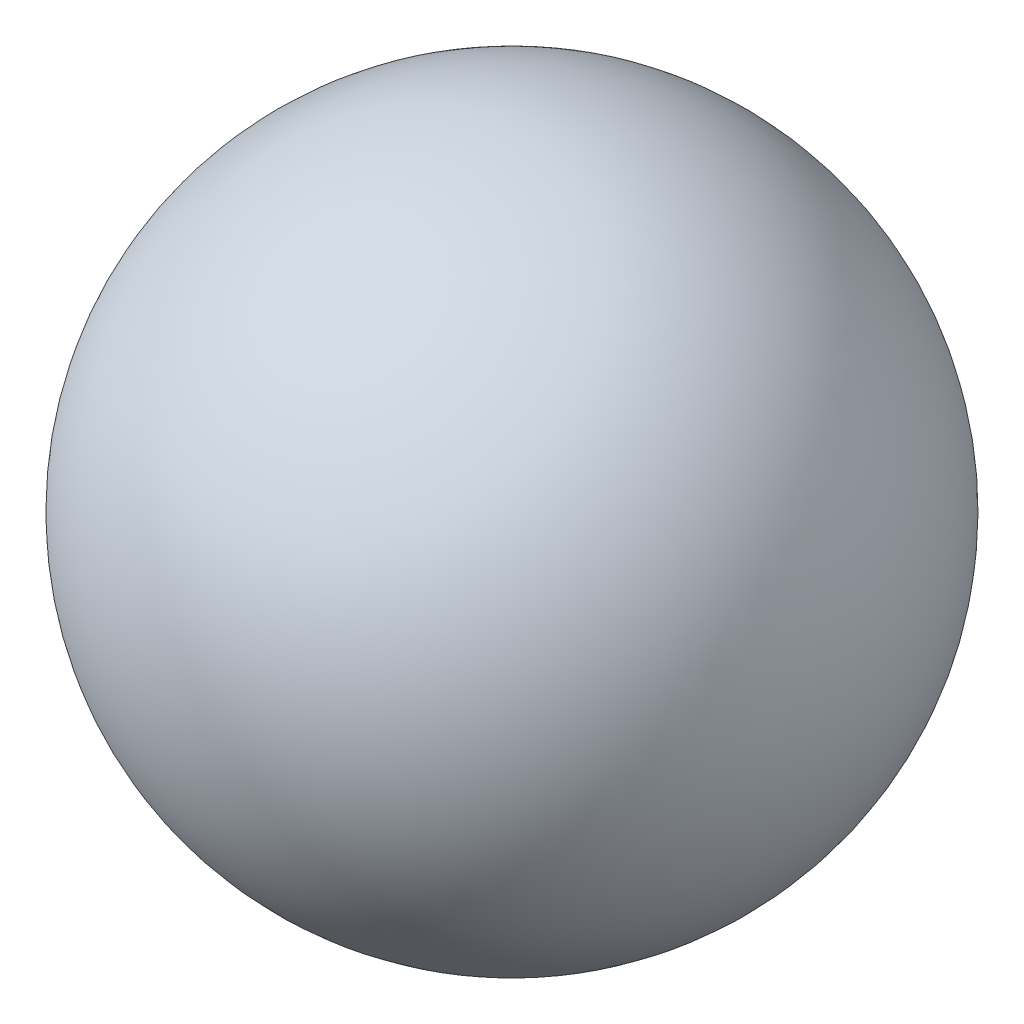
ISO-10303-21;
HEADER;
FILE_DESCRIPTION(('STEP AP214'),'2;1');
FILE_NAME('part.step','',(''),(''),'','','');
FILE_SCHEMA(('AUTOMOTIVE_DESIGN { 1 0 10303 214 1 1 1 1 }'));
ENDSEC;
DATA;
#1=APPLICATION_CONTEXT('core data for automotive mechanical design processes');
#2=APPLICATION_PROTOCOL_DEFINITION('international standard','automotive_design',2000,#1);
#3=PRODUCT_CONTEXT('',#1,'mechanical');
#4=PRODUCT('Part','Part','',(#3));
#5=PRODUCT_RELATED_PRODUCT_CATEGORY('part','',(#4));
#6=PRODUCT_DEFINITION_FORMATION('','',#4);
#7=PRODUCT_DEFINITION_CONTEXT('part definition',#1,'design');
#8=PRODUCT_DEFINITION('design','',#6,#7);
#9=PRODUCT_DEFINITION_SHAPE('','',#8);
#10=(LENGTH_UNIT() NAMED_UNIT(*) SI_UNIT(.MILLI.,.METRE.));
#11=(NAMED_UNIT(*) PLANE_ANGLE_UNIT() SI_UNIT($,.RADIAN.));
#12=(NAMED_UNIT(*) SI_UNIT($,.STERADIAN.) SOLID_ANGLE_UNIT());
#13=UNCERTAINTY_MEASURE_WITH_UNIT(LENGTH_MEASURE(1.E-05),#10,'distance_accuracy_value','');
#14=(GEOMETRIC_REPRESENTATION_CONTEXT(3) GLOBAL_UNCERTAINTY_ASSIGNED_CONTEXT((#13)) GLOBAL_UNIT_ASSIGNED_CONTEXT((#10,
#11,#12)) REPRESENTATION_CONTEXT('',''));
#15=CARTESIAN_POINT('',(0.,0.,0.));
#16=DIRECTION('',(0.,0.,1.));
#17=DIRECTION('',(1.,0.,0.));
#18=AXIS2_PLACEMENT_3D('',#15,#16,#17);
#19=CARTESIAN_POINT('',(0.,0.,0.));
#20=DIRECTION('',(0.,1.,0.));
#21=DIRECTION('',(1.,0.,0.));
#22=AXIS2_PLACEMENT_3D('',#19,#20,#21);
#23=SPHERICAL_SURFACE('',#22,10.);
#24=CARTESIAN_POINT('',(0.,-8.5,0.));
#25=DIRECTION('',(0.,1.,0.));
#26=DIRECTION('',(0.,0.,1.));
#27=AXIS2_PLACEMENT_3D('',#24,#25,#26);
#28=CIRCLE('',#27,5.26782687642637);
#29=CARTESIAN_POINT('',(0.,-8.5,5.26782687642637));
#30=VERTEX_POINT('',#29);
#31=EDGE_CURVE('E10',#30,#30,#28,.T.);
#32=ORIENTED_EDGE('',*,*,#31,.T.);
#33=EDGE_LOOP('',(#32));
#34=FACE_BOUND('',#33,.T.);
#35=ADVANCED_FACE('F32',(#34),#23,.T.);
#36=CARTESIAN_POINT('',(-6.,-8.5,-6.));
#37=DIRECTION('',(0.,1.,0.));
#38=DIRECTION('',(0.,0.,1.));
#39=AXIS2_PLACEMENT_3D('',#36,#37,#38);
#40=PLANE('',#39);
#41=CARTESIAN_POINT('',(0.,-8.5,0.));
#42=DIRECTION('',(0.,-1.,0.));
#43=DIRECTION('',(0.,0.,-1.));
#44=AXIS2_PLACEMENT_3D('',#41,#42,#43);
#45=CIRCLE('',#44,3.);
#46=CARTESIAN_POINT('',(0.,-8.5,-3.));
#47=VERTEX_POINT('',#46);
#48=EDGE_CURVE('E42',#47,#47,#45,.T.);
#49=ORIENTED_EDGE('',*,*,#48,.F.);
#50=EDGE_LOOP('',(#49));
#51=FACE_BOUND('',#50,.T.);
#52=ORIENTED_EDGE('',*,*,#31,.F.);
#53=EDGE_LOOP('',(#52));
#54=FACE_BOUND('',#53,.T.);
#55=ADVANCED_FACE('F51',(#51,#54),#40,.F.);
#56=CARTESIAN_POINT('',(0.,6.5,0.));
#57=DIRECTION('',(0.,-1.,0.));
#58=DIRECTION('',(0.,0.,-1.));
#59=AXIS2_PLACEMENT_3D('',#56,#57,#58);
#60=CYLINDRICAL_SURFACE('',#59,3.);
#61=CARTESIAN_POINT('',(0.,6.5,0.));
#62=DIRECTION('',(0.,-1.,0.));
#63=DIRECTION('',(0.,0.,-1.));
#64=AXIS2_PLACEMENT_3D('',#61,#62,#63);
#65=CIRCLE('',#64,3.);
#66=CARTESIAN_POINT('',(0.,6.5,-3.));
#67=VERTEX_POINT('',#66);
#68=EDGE_CURVE('E38',#67,#67,#65,.T.);
#69=ORIENTED_EDGE('',*,*,#68,.F.);
#70=EDGE_LOOP('',(#69));
#71=FACE_BOUND('',#70,.T.);
#72=ORIENTED_EDGE('',*,*,#48,.T.);
#73=EDGE_LOOP('',(#72));
#74=FACE_BOUND('',#73,.T.);
#75=ADVANCED_FACE('F49',(#71,#74),#60,.F.);
#76=CARTESIAN_POINT('',(0.,6.5,0.));
#77=DIRECTION('',(0.,-1.,0.));
#78=DIRECTION('',(0.,0.,-1.));
#79=AXIS2_PLACEMENT_3D('',#76,#77,#78);
#80=PLANE('',#79);
#81=ORIENTED_EDGE('',*,*,#68,.T.);
#82=EDGE_LOOP('',(#81));
#83=FACE_BOUND('',#82,.T.);
#84=ADVANCED_FACE('F58',(#83),#80,.T.);
#85=CLOSED_SHELL('',(#35,#55,#75,#84));
#86=MANIFOLD_SOLID_BREP('B2',#85);
#87=ADVANCED_BREP_SHAPE_REPRESENTATION('',(#18,#86),#14);
#88=SHAPE_DEFINITION_REPRESENTATION(#9,#87);
ENDSEC;
END-ISO-10303-21;
